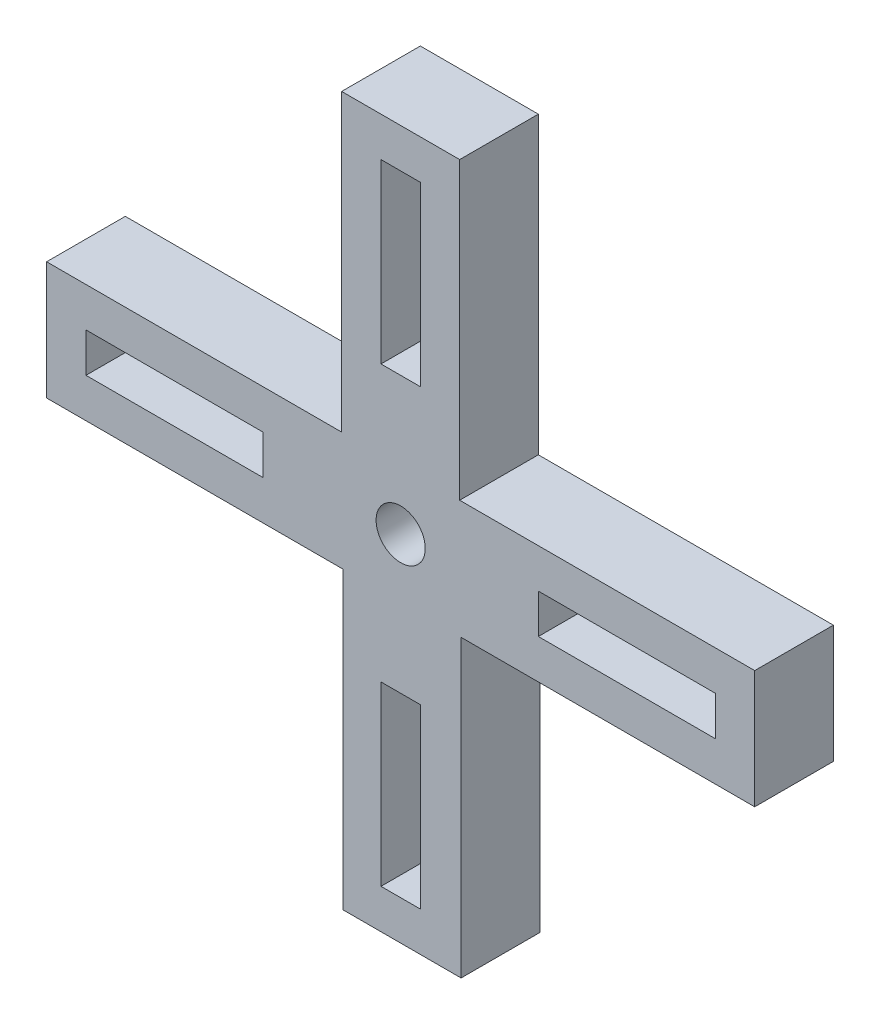
ISO-10303-21;
HEADER;
FILE_DESCRIPTION(('STEP AP214'),'2;1');
FILE_NAME('part.step','',(''),(''),'','','');
FILE_SCHEMA(('AUTOMOTIVE_DESIGN { 1 0 10303 214 1 1 1 1 }'));
ENDSEC;
DATA;
#1=APPLICATION_CONTEXT('core data for automotive mechanical design processes');
#2=APPLICATION_PROTOCOL_DEFINITION('international standard','automotive_design',2000,#1);
#3=PRODUCT_CONTEXT('',#1,'mechanical');
#4=PRODUCT('Part','Part','',(#3));
#5=PRODUCT_RELATED_PRODUCT_CATEGORY('part','',(#4));
#6=PRODUCT_DEFINITION_FORMATION('','',#4);
#7=PRODUCT_DEFINITION_CONTEXT('part definition',#1,'design');
#8=PRODUCT_DEFINITION('design','',#6,#7);
#9=PRODUCT_DEFINITION_SHAPE('','',#8);
#10=(LENGTH_UNIT() NAMED_UNIT(*) SI_UNIT(.MILLI.,.METRE.));
#11=(NAMED_UNIT(*) PLANE_ANGLE_UNIT() SI_UNIT($,.RADIAN.));
#12=(NAMED_UNIT(*) SI_UNIT($,.STERADIAN.) SOLID_ANGLE_UNIT());
#13=UNCERTAINTY_MEASURE_WITH_UNIT(LENGTH_MEASURE(1.E-05),#10,'distance_accuracy_value','');
#14=(GEOMETRIC_REPRESENTATION_CONTEXT(3) GLOBAL_UNCERTAINTY_ASSIGNED_CONTEXT((#13)) GLOBAL_UNIT_ASSIGNED_CONTEXT((#10,
#11,#12)) REPRESENTATION_CONTEXT('',''));
#15=CARTESIAN_POINT('',(0.,0.,0.));
#16=DIRECTION('',(0.,0.,1.));
#17=DIRECTION('',(1.,0.,0.));
#18=AXIS2_PLACEMENT_3D('',#15,#16,#17);
#19=CARTESIAN_POINT('',(0.,0.,4.));
#20=DIRECTION('',(0.,0.,-1.));
#21=DIRECTION('',(-1.,0.,0.));
#22=AXIS2_PLACEMENT_3D('',#19,#20,#21);
#23=PLANE('',#22);
#24=CARTESIAN_POINT('',(-3.,-18.,4.));
#25=DIRECTION('',(0.,0.,1.));
#26=DIRECTION('',(1.,0.,0.));
#27=AXIS2_PLACEMENT_3D('',#24,#25,#26);
#28=CIRCLE('',#27,1.25);
#29=CARTESIAN_POINT('',(-1.75,-18.,4.));
#30=VERTEX_POINT('',#29);
#31=EDGE_CURVE('E967',#30,#30,#28,.T.);
#32=ORIENTED_EDGE('',*,*,#31,.F.);
#33=EDGE_LOOP('',(#32));
#34=FACE_BOUND('',#33,.T.);
#35=DIRECTION('',(0.,-1.,0.));
#36=VECTOR('',#35,1.);
#37=CARTESIAN_POINT('',(4.,-17.,4.));
#38=LINE('',#37,#36);
#39=CARTESIAN_POINT('',(4.,-17.,4.));
#40=VERTEX_POINT('',#39);
#41=CARTESIAN_POINT('',(4.,-19.,4.));
#42=VERTEX_POINT('',#41);
#43=EDGE_CURVE('E448',#40,#42,#38,.T.);
#44=ORIENTED_EDGE('',*,*,#43,.F.);
#45=DIRECTION('',(1.,0.,0.));
#46=VECTOR('',#45,1.);
#47=CARTESIAN_POINT('',(4.,-17.,4.));
#48=LINE('',#47,#46);
#49=CARTESIAN_POINT('',(13.,-17.,4.));
#50=VERTEX_POINT('',#49);
#51=EDGE_CURVE('E456',#40,#50,#48,.T.);
#52=ORIENTED_EDGE('',*,*,#51,.T.);
#53=DIRECTION('',(0.,-1.,0.));
#54=VECTOR('',#53,1.);
#55=CARTESIAN_POINT('',(13.,-17.,4.));
#56=LINE('',#55,#54);
#57=CARTESIAN_POINT('',(13.,-19.,4.));
#58=VERTEX_POINT('',#57);
#59=EDGE_CURVE('E453',#50,#58,#56,.T.);
#60=ORIENTED_EDGE('',*,*,#59,.T.);
#61=DIRECTION('',(1.,0.,0.));
#62=VECTOR('',#61,1.);
#63=CARTESIAN_POINT('',(4.,-19.,4.));
#64=LINE('',#63,#62);
#65=EDGE_CURVE('E450',#42,#58,#64,.T.);
#66=ORIENTED_EDGE('',*,*,#65,.F.);
#67=EDGE_LOOP('',(#44,#52,#60,#66));
#68=FACE_BOUND('',#67,.T.);
#69=DIRECTION('',(-1.,0.,0.));
#70=VECTOR('',#69,1.);
#71=CARTESIAN_POINT('',(-2.,-2.,4.));
#72=LINE('',#71,#70);
#73=CARTESIAN_POINT('',(-2.,-2.,4.));
#74=VERTEX_POINT('',#73);
#75=CARTESIAN_POINT('',(-4.,-2.,4.));
#76=VERTEX_POINT('',#75);
#77=EDGE_CURVE('E512',#74,#76,#72,.T.);
#78=ORIENTED_EDGE('',*,*,#77,.F.);
#79=DIRECTION('',(0.,1.,0.));
#80=VECTOR('',#79,1.);
#81=CARTESIAN_POINT('',(-2.,-11.,4.));
#82=LINE('',#81,#80);
#83=CARTESIAN_POINT('',(-2.,-11.,4.));
#84=VERTEX_POINT('',#83);
#85=EDGE_CURVE('E520',#84,#74,#82,.T.);
#86=ORIENTED_EDGE('',*,*,#85,.F.);
#87=DIRECTION('',(1.,0.,0.));
#88=VECTOR('',#87,1.);
#89=CARTESIAN_POINT('',(-4.,-11.,4.));
#90=LINE('',#89,#88);
#91=CARTESIAN_POINT('',(-4.,-11.,4.));
#92=VERTEX_POINT('',#91);
#93=EDGE_CURVE('E517',#92,#84,#90,.T.);
#94=ORIENTED_EDGE('',*,*,#93,.F.);
#95=DIRECTION('',(0.,-1.,0.));
#96=VECTOR('',#95,1.);
#97=CARTESIAN_POINT('',(-4.,-2.,4.));
#98=LINE('',#97,#96);
#99=EDGE_CURVE('E514',#76,#92,#98,.T.);
#100=ORIENTED_EDGE('',*,*,#99,.F.);
#101=EDGE_LOOP('',(#78,#86,#94,#100));
#102=FACE_BOUND('',#101,.T.);
#103=DIRECTION('',(-1.,0.,0.));
#104=VECTOR('',#103,1.);
#105=CARTESIAN_POINT('',(15.,-15.,4.));
#106=LINE('',#105,#104);
#107=CARTESIAN_POINT('',(15.,-15.,4.));
#108=VERTEX_POINT('',#107);
#109=CARTESIAN_POINT('',(0.,-15.,4.));
#110=VERTEX_POINT('',#109);
#111=EDGE_CURVE('E543',#108,#110,#106,.T.);
#112=ORIENTED_EDGE('',*,*,#111,.T.);
#113=DIRECTION('',(0.,1.,0.));
#114=VECTOR('',#113,1.);
#115=CARTESIAN_POINT('',(0.,-15.,4.));
#116=LINE('',#115,#114);
#117=CARTESIAN_POINT('',(0.,0.,4.));
#118=VERTEX_POINT('',#117);
#119=EDGE_CURVE('E546',#110,#118,#116,.T.);
#120=ORIENTED_EDGE('',*,*,#119,.T.);
#121=DIRECTION('',(-1.,0.,0.));
#122=VECTOR('',#121,1.);
#123=CARTESIAN_POINT('',(0.,0.,4.));
#124=LINE('',#123,#122);
#125=CARTESIAN_POINT('',(-6.,0.,4.));
#126=VERTEX_POINT('',#125);
#127=EDGE_CURVE('E549',#118,#126,#124,.T.);
#128=ORIENTED_EDGE('',*,*,#127,.T.);
#129=DIRECTION('',(0.,-1.,0.));
#130=VECTOR('',#129,1.);
#131=CARTESIAN_POINT('',(-6.,0.,4.));
#132=LINE('',#131,#130);
#133=CARTESIAN_POINT('',(-6.,-15.,4.));
#134=VERTEX_POINT('',#133);
#135=EDGE_CURVE('E551',#126,#134,#132,.T.);
#136=ORIENTED_EDGE('',*,*,#135,.T.);
#137=DIRECTION('',(-1.,0.,0.));
#138=VECTOR('',#137,1.);
#139=CARTESIAN_POINT('',(-6.,-15.,4.));
#140=LINE('',#139,#138);
#141=CARTESIAN_POINT('',(-21.,-15.,4.));
#142=VERTEX_POINT('',#141);
#143=EDGE_CURVE('E553',#134,#142,#140,.T.);
#144=ORIENTED_EDGE('',*,*,#143,.T.);
#145=DIRECTION('',(0.,-1.,0.));
#146=VECTOR('',#145,1.);
#147=CARTESIAN_POINT('',(-21.,-15.,4.));
#148=LINE('',#147,#146);
#149=CARTESIAN_POINT('',(-21.,-21.,4.));
#150=VERTEX_POINT('',#149);
#151=EDGE_CURVE('E555',#142,#150,#148,.T.);
#152=ORIENTED_EDGE('',*,*,#151,.T.);
#153=DIRECTION('',(1.,0.,0.));
#154=VECTOR('',#153,1.);
#155=CARTESIAN_POINT('',(-21.,-21.,4.));
#156=LINE('',#155,#154);
#157=CARTESIAN_POINT('',(-5.92785465377647,-21.,4.));
#158=VERTEX_POINT('',#157);
#159=EDGE_CURVE('E557',#150,#158,#156,.T.);
#160=ORIENTED_EDGE('',*,*,#159,.T.);
#161=DIRECTION('',(0.,-1.,0.));
#162=VECTOR('',#161,1.);
#163=CARTESIAN_POINT('',(-5.92785465377647,-21.,4.));
#164=LINE('',#163,#162);
#165=CARTESIAN_POINT('',(-5.92785465377647,-36.,4.));
#166=VERTEX_POINT('',#165);
#167=EDGE_CURVE('E559',#158,#166,#164,.T.);
#168=ORIENTED_EDGE('',*,*,#167,.T.);
#169=DIRECTION('',(1.,0.,0.));
#170=VECTOR('',#169,1.);
#171=CARTESIAN_POINT('',(-5.92785465377647,-36.,4.));
#172=LINE('',#171,#170);
#173=CARTESIAN_POINT('',(0.0721453462235299,-36.,4.));
#174=VERTEX_POINT('',#173);
#175=EDGE_CURVE('E561',#166,#174,#172,.T.);
#176=ORIENTED_EDGE('',*,*,#175,.T.);
#177=DIRECTION('',(0.,1.,0.));
#178=VECTOR('',#177,1.);
#179=CARTESIAN_POINT('',(0.0721453462235299,-36.,4.));
#180=LINE('',#179,#178);
#181=CARTESIAN_POINT('',(0.0721453462235299,-21.,4.));
#182=VERTEX_POINT('',#181);
#183=EDGE_CURVE('E563',#174,#182,#180,.T.);
#184=ORIENTED_EDGE('',*,*,#183,.T.);
#185=DIRECTION('',(1.,0.,0.));
#186=VECTOR('',#185,1.);
#187=CARTESIAN_POINT('',(0.0721453462235299,-21.,4.));
#188=LINE('',#187,#186);
#189=CARTESIAN_POINT('',(15.,-21.,4.));
#190=VERTEX_POINT('',#189);
#191=EDGE_CURVE('E565',#182,#190,#188,.T.);
#192=ORIENTED_EDGE('',*,*,#191,.T.);
#193=DIRECTION('',(0.,1.,0.));
#194=VECTOR('',#193,1.);
#195=CARTESIAN_POINT('',(15.,-21.,4.));
#196=LINE('',#195,#194);
#197=EDGE_CURVE('E567',#190,#108,#196,.T.);
#198=ORIENTED_EDGE('',*,*,#197,.T.);
#199=EDGE_LOOP('',(#112,#120,#128,#136,#144,#152,#160,#168,#176,#184,#192,#198));
#200=FACE_BOUND('',#199,.T.);
#201=DIRECTION('',(0.,-1.,0.));
#202=VECTOR('',#201,1.);
#203=CARTESIAN_POINT('',(-4.,-25.,4.));
#204=LINE('',#203,#202);
#205=CARTESIAN_POINT('',(-4.,-25.,4.));
#206=VERTEX_POINT('',#205);
#207=CARTESIAN_POINT('',(-4.,-34.,4.));
#208=VERTEX_POINT('',#207);
#209=EDGE_CURVE('E480',#206,#208,#204,.T.);
#210=ORIENTED_EDGE('',*,*,#209,.F.);
#211=DIRECTION('',(1.,0.,0.));
#212=VECTOR('',#211,1.);
#213=CARTESIAN_POINT('',(-4.,-25.,4.));
#214=LINE('',#213,#212);
#215=CARTESIAN_POINT('',(-2.,-25.,4.));
#216=VERTEX_POINT('',#215);
#217=EDGE_CURVE('E488',#206,#216,#214,.T.);
#218=ORIENTED_EDGE('',*,*,#217,.T.);
#219=DIRECTION('',(0.,-1.,0.));
#220=VECTOR('',#219,1.);
#221=CARTESIAN_POINT('',(-2.,-25.,4.));
#222=LINE('',#221,#220);
#223=CARTESIAN_POINT('',(-2.,-34.,4.));
#224=VERTEX_POINT('',#223);
#225=EDGE_CURVE('E485',#216,#224,#222,.T.);
#226=ORIENTED_EDGE('',*,*,#225,.T.);
#227=DIRECTION('',(1.,0.,0.));
#228=VECTOR('',#227,1.);
#229=CARTESIAN_POINT('',(-4.,-34.,4.));
#230=LINE('',#229,#228);
#231=EDGE_CURVE('E482',#208,#224,#230,.T.);
#232=ORIENTED_EDGE('',*,*,#231,.F.);
#233=EDGE_LOOP('',(#210,#218,#226,#232));
#234=FACE_BOUND('',#233,.T.);
#235=DIRECTION('',(0.,-1.,0.));
#236=VECTOR('',#235,1.);
#237=CARTESIAN_POINT('',(-19.,-17.,4.));
#238=LINE('',#237,#236);
#239=CARTESIAN_POINT('',(-19.,-17.,4.));
#240=VERTEX_POINT('',#239);
#241=CARTESIAN_POINT('',(-19.,-19.,4.));
#242=VERTEX_POINT('',#241);
#243=EDGE_CURVE('E410',#240,#242,#238,.T.);
#244=ORIENTED_EDGE('',*,*,#243,.F.);
#245=DIRECTION('',(-1.,0.,0.));
#246=VECTOR('',#245,1.);
#247=CARTESIAN_POINT('',(-10.,-17.,4.));
#248=LINE('',#247,#246);
#249=CARTESIAN_POINT('',(-10.,-17.,4.));
#250=VERTEX_POINT('',#249);
#251=EDGE_CURVE('E432',#250,#240,#248,.T.);
#252=ORIENTED_EDGE('',*,*,#251,.F.);
#253=DIRECTION('',(0.,1.,0.));
#254=VECTOR('',#253,1.);
#255=CARTESIAN_POINT('',(-10.,-19.,4.));
#256=LINE('',#255,#254);
#257=CARTESIAN_POINT('',(-10.,-19.,4.));
#258=VERTEX_POINT('',#257);
#259=EDGE_CURVE('E430',#258,#250,#256,.T.);
#260=ORIENTED_EDGE('',*,*,#259,.F.);
#261=DIRECTION('',(1.,0.,0.));
#262=VECTOR('',#261,1.);
#263=CARTESIAN_POINT('',(-19.,-19.,4.));
#264=LINE('',#263,#262);
#265=EDGE_CURVE('E418',#242,#258,#264,.T.);
#266=ORIENTED_EDGE('',*,*,#265,.F.);
#267=EDGE_LOOP('',(#244,#252,#260,#266));
#268=FACE_BOUND('',#267,.T.);
#269=ADVANCED_FACE('F225',(#34,#68,#102,#200,#234,#268),#23,.F.);
#270=CARTESIAN_POINT('',(0.,0.,0.));
#271=DIRECTION('',(0.,0.,-1.));
#272=DIRECTION('',(-1.,0.,0.));
#273=AXIS2_PLACEMENT_3D('',#270,#271,#272);
#274=PLANE('',#273);
#275=CARTESIAN_POINT('',(-3.,-18.,0.));
#276=DIRECTION('',(0.,0.,1.));
#277=DIRECTION('',(1.,0.,0.));
#278=AXIS2_PLACEMENT_3D('',#275,#276,#277);
#279=CIRCLE('',#278,1.25);
#280=CARTESIAN_POINT('',(-1.75,-18.,0.));
#281=VERTEX_POINT('',#280);
#282=EDGE_CURVE('E438',#281,#281,#279,.T.);
#283=ORIENTED_EDGE('',*,*,#282,.T.);
#284=EDGE_LOOP('',(#283));
#285=FACE_BOUND('',#284,.T.);
#286=DIRECTION('',(1.,0.,0.));
#287=VECTOR('',#286,1.);
#288=CARTESIAN_POINT('',(4.,-17.,0.));
#289=LINE('',#288,#287);
#290=CARTESIAN_POINT('',(4.,-17.,0.));
#291=VERTEX_POINT('',#290);
#292=CARTESIAN_POINT('',(13.,-17.,0.));
#293=VERTEX_POINT('',#292);
#294=EDGE_CURVE('E451',#291,#293,#289,.T.);
#295=ORIENTED_EDGE('',*,*,#294,.F.);
#296=DIRECTION('',(0.,-1.,0.));
#297=VECTOR('',#296,1.);
#298=CARTESIAN_POINT('',(4.,-17.,0.));
#299=LINE('',#298,#297);
#300=CARTESIAN_POINT('',(4.,-19.,0.));
#301=VERTEX_POINT('',#300);
#302=EDGE_CURVE('E426',#291,#301,#299,.T.);
#303=ORIENTED_EDGE('',*,*,#302,.T.);
#304=DIRECTION('',(1.,0.,0.));
#305=VECTOR('',#304,1.);
#306=CARTESIAN_POINT('',(4.,-19.,0.));
#307=LINE('',#306,#305);
#308=CARTESIAN_POINT('',(13.,-19.,0.));
#309=VERTEX_POINT('',#308);
#310=EDGE_CURVE('E462',#301,#309,#307,.T.);
#311=ORIENTED_EDGE('',*,*,#310,.T.);
#312=DIRECTION('',(0.,-1.,0.));
#313=VECTOR('',#312,1.);
#314=CARTESIAN_POINT('',(13.,-17.,0.));
#315=LINE('',#314,#313);
#316=EDGE_CURVE('E465',#293,#309,#315,.T.);
#317=ORIENTED_EDGE('',*,*,#316,.F.);
#318=EDGE_LOOP('',(#295,#303,#311,#317));
#319=FACE_BOUND('',#318,.T.);
#320=DIRECTION('',(0.,1.,0.));
#321=VECTOR('',#320,1.);
#322=CARTESIAN_POINT('',(-2.,-11.,0.));
#323=LINE('',#322,#321);
#324=CARTESIAN_POINT('',(-2.,-11.,0.));
#325=VERTEX_POINT('',#324);
#326=CARTESIAN_POINT('',(-2.,-2.,0.));
#327=VERTEX_POINT('',#326);
#328=EDGE_CURVE('E515',#325,#327,#323,.T.);
#329=ORIENTED_EDGE('',*,*,#328,.T.);
#330=DIRECTION('',(-1.,0.,0.));
#331=VECTOR('',#330,1.);
#332=CARTESIAN_POINT('',(-2.,-2.,0.));
#333=LINE('',#332,#331);
#334=CARTESIAN_POINT('',(-4.,-2.,0.));
#335=VERTEX_POINT('',#334);
#336=EDGE_CURVE('E511',#327,#335,#333,.T.);
#337=ORIENTED_EDGE('',*,*,#336,.T.);
#338=DIRECTION('',(0.,-1.,0.));
#339=VECTOR('',#338,1.);
#340=CARTESIAN_POINT('',(-4.,-2.,0.));
#341=LINE('',#340,#339);
#342=CARTESIAN_POINT('',(-4.,-11.,0.));
#343=VERTEX_POINT('',#342);
#344=EDGE_CURVE('E525',#335,#343,#341,.T.);
#345=ORIENTED_EDGE('',*,*,#344,.T.);
#346=DIRECTION('',(1.,0.,0.));
#347=VECTOR('',#346,1.);
#348=CARTESIAN_POINT('',(-4.,-11.,0.));
#349=LINE('',#348,#347);
#350=EDGE_CURVE('E528',#343,#325,#349,.T.);
#351=ORIENTED_EDGE('',*,*,#350,.T.);
#352=EDGE_LOOP('',(#329,#337,#345,#351));
#353=FACE_BOUND('',#352,.T.);
#354=DIRECTION('',(-1.,0.,0.));
#355=VECTOR('',#354,1.);
#356=CARTESIAN_POINT('',(15.,-15.,0.));
#357=LINE('',#356,#355);
#358=CARTESIAN_POINT('',(15.,-15.,0.));
#359=VERTEX_POINT('',#358);
#360=CARTESIAN_POINT('',(0.,-15.,0.));
#361=VERTEX_POINT('',#360);
#362=EDGE_CURVE('E542',#359,#361,#357,.T.);
#363=ORIENTED_EDGE('',*,*,#362,.F.);
#364=DIRECTION('',(0.,1.,0.));
#365=VECTOR('',#364,1.);
#366=CARTESIAN_POINT('',(15.,-21.,0.));
#367=LINE('',#366,#365);
#368=CARTESIAN_POINT('',(15.,-21.,0.));
#369=VERTEX_POINT('',#368);
#370=EDGE_CURVE('E547',#369,#359,#367,.T.);
#371=ORIENTED_EDGE('',*,*,#370,.F.);
#372=DIRECTION('',(1.,0.,0.));
#373=VECTOR('',#372,1.);
#374=CARTESIAN_POINT('',(0.0721453462235299,-21.,0.));
#375=LINE('',#374,#373);
#376=CARTESIAN_POINT('',(0.0721453462235299,-21.,0.));
#377=VERTEX_POINT('',#376);
#378=EDGE_CURVE('E590',#377,#369,#375,.T.);
#379=ORIENTED_EDGE('',*,*,#378,.F.);
#380=DIRECTION('',(0.,1.,0.));
#381=VECTOR('',#380,1.);
#382=CARTESIAN_POINT('',(0.0721453462235299,-36.,0.));
#383=LINE('',#382,#381);
#384=CARTESIAN_POINT('',(0.0721453462235299,-36.,0.));
#385=VERTEX_POINT('',#384);
#386=EDGE_CURVE('E588',#385,#377,#383,.T.);
#387=ORIENTED_EDGE('',*,*,#386,.F.);
#388=DIRECTION('',(1.,0.,0.));
#389=VECTOR('',#388,1.);
#390=CARTESIAN_POINT('',(-5.92785465377647,-36.,0.));
#391=LINE('',#390,#389);
#392=CARTESIAN_POINT('',(-5.92785465377647,-36.,0.));
#393=VERTEX_POINT('',#392);
#394=EDGE_CURVE('E586',#393,#385,#391,.T.);
#395=ORIENTED_EDGE('',*,*,#394,.F.);
#396=DIRECTION('',(0.,-1.,0.));
#397=VECTOR('',#396,1.);
#398=CARTESIAN_POINT('',(-5.92785465377647,-21.,0.));
#399=LINE('',#398,#397);
#400=CARTESIAN_POINT('',(-5.92785465377647,-21.,0.));
#401=VERTEX_POINT('',#400);
#402=EDGE_CURVE('E584',#401,#393,#399,.T.);
#403=ORIENTED_EDGE('',*,*,#402,.F.);
#404=DIRECTION('',(1.,0.,0.));
#405=VECTOR('',#404,1.);
#406=CARTESIAN_POINT('',(-21.,-21.,0.));
#407=LINE('',#406,#405);
#408=CARTESIAN_POINT('',(-21.,-21.,0.));
#409=VERTEX_POINT('',#408);
#410=EDGE_CURVE('E582',#409,#401,#407,.T.);
#411=ORIENTED_EDGE('',*,*,#410,.F.);
#412=DIRECTION('',(0.,-1.,0.));
#413=VECTOR('',#412,1.);
#414=CARTESIAN_POINT('',(-21.,-15.,0.));
#415=LINE('',#414,#413);
#416=CARTESIAN_POINT('',(-21.,-15.,0.));
#417=VERTEX_POINT('',#416);
#418=EDGE_CURVE('E580',#417,#409,#415,.T.);
#419=ORIENTED_EDGE('',*,*,#418,.F.);
#420=DIRECTION('',(-1.,0.,0.));
#421=VECTOR('',#420,1.);
#422=CARTESIAN_POINT('',(-6.,-15.,0.));
#423=LINE('',#422,#421);
#424=CARTESIAN_POINT('',(-6.,-15.,0.));
#425=VERTEX_POINT('',#424);
#426=EDGE_CURVE('E578',#425,#417,#423,.T.);
#427=ORIENTED_EDGE('',*,*,#426,.F.);
#428=DIRECTION('',(0.,-1.,0.));
#429=VECTOR('',#428,1.);
#430=CARTESIAN_POINT('',(-6.,0.,0.));
#431=LINE('',#430,#429);
#432=CARTESIAN_POINT('',(-6.,0.,0.));
#433=VERTEX_POINT('',#432);
#434=EDGE_CURVE('E576',#433,#425,#431,.T.);
#435=ORIENTED_EDGE('',*,*,#434,.F.);
#436=DIRECTION('',(-1.,0.,0.));
#437=VECTOR('',#436,1.);
#438=CARTESIAN_POINT('',(0.,0.,0.));
#439=LINE('',#438,#437);
#440=CARTESIAN_POINT('',(0.,0.,0.));
#441=VERTEX_POINT('',#440);
#442=EDGE_CURVE('E574',#441,#433,#439,.T.);
#443=ORIENTED_EDGE('',*,*,#442,.F.);
#444=DIRECTION('',(0.,1.,0.));
#445=VECTOR('',#444,1.);
#446=CARTESIAN_POINT('',(0.,-15.,0.));
#447=LINE('',#446,#445);
#448=EDGE_CURVE('E572',#361,#441,#447,.T.);
#449=ORIENTED_EDGE('',*,*,#448,.F.);
#450=EDGE_LOOP('',(#363,#371,#379,#387,#395,#403,#411,#419,#427,#435,#443,#449));
#451=FACE_BOUND('',#450,.T.);
#452=DIRECTION('',(1.,0.,0.));
#453=VECTOR('',#452,1.);
#454=CARTESIAN_POINT('',(-4.,-25.,0.));
#455=LINE('',#454,#453);
#456=CARTESIAN_POINT('',(-4.,-25.,0.));
#457=VERTEX_POINT('',#456);
#458=CARTESIAN_POINT('',(-2.,-25.,0.));
#459=VERTEX_POINT('',#458);
#460=EDGE_CURVE('E483',#457,#459,#455,.T.);
#461=ORIENTED_EDGE('',*,*,#460,.F.);
#462=DIRECTION('',(0.,-1.,0.));
#463=VECTOR('',#462,1.);
#464=CARTESIAN_POINT('',(-4.,-25.,0.));
#465=LINE('',#464,#463);
#466=CARTESIAN_POINT('',(-4.,-34.,0.));
#467=VERTEX_POINT('',#466);
#468=EDGE_CURVE('E479',#457,#467,#465,.T.);
#469=ORIENTED_EDGE('',*,*,#468,.T.);
#470=DIRECTION('',(1.,0.,0.));
#471=VECTOR('',#470,1.);
#472=CARTESIAN_POINT('',(-4.,-34.,0.));
#473=LINE('',#472,#471);
#474=CARTESIAN_POINT('',(-2.,-34.,0.));
#475=VERTEX_POINT('',#474);
#476=EDGE_CURVE('E494',#467,#475,#473,.T.);
#477=ORIENTED_EDGE('',*,*,#476,.T.);
#478=DIRECTION('',(0.,-1.,0.));
#479=VECTOR('',#478,1.);
#480=CARTESIAN_POINT('',(-2.,-25.,0.));
#481=LINE('',#480,#479);
#482=EDGE_CURVE('E497',#459,#475,#481,.T.);
#483=ORIENTED_EDGE('',*,*,#482,.F.);
#484=EDGE_LOOP('',(#461,#469,#477,#483));
#485=FACE_BOUND('',#484,.T.);
#486=DIRECTION('',(-1.,0.,0.));
#487=VECTOR('',#486,1.);
#488=CARTESIAN_POINT('',(-10.,-17.,0.));
#489=LINE('',#488,#487);
#490=CARTESIAN_POINT('',(-10.,-17.,0.));
#491=VERTEX_POINT('',#490);
#492=CARTESIAN_POINT('',(-19.,-17.,0.));
#493=VERTEX_POINT('',#492);
#494=EDGE_CURVE('E419',#491,#493,#489,.T.);
#495=ORIENTED_EDGE('',*,*,#494,.T.);
#496=DIRECTION('',(0.,-1.,0.));
#497=VECTOR('',#496,1.);
#498=CARTESIAN_POINT('',(-19.,-17.,0.));
#499=LINE('',#498,#497);
#500=CARTESIAN_POINT('',(-19.,-19.,0.));
#501=VERTEX_POINT('',#500);
#502=EDGE_CURVE('E248',#493,#501,#499,.T.);
#503=ORIENTED_EDGE('',*,*,#502,.T.);
#504=DIRECTION('',(1.,0.,0.));
#505=VECTOR('',#504,1.);
#506=CARTESIAN_POINT('',(-19.,-19.,0.));
#507=LINE('',#506,#505);
#508=CARTESIAN_POINT('',(-10.,-19.,0.));
#509=VERTEX_POINT('',#508);
#510=EDGE_CURVE('E425',#501,#509,#507,.T.);
#511=ORIENTED_EDGE('',*,*,#510,.T.);
#512=DIRECTION('',(0.,1.,0.));
#513=VECTOR('',#512,1.);
#514=CARTESIAN_POINT('',(-10.,-19.,0.));
#515=LINE('',#514,#513);
#516=EDGE_CURVE('E440',#509,#491,#515,.T.);
#517=ORIENTED_EDGE('',*,*,#516,.T.);
#518=EDGE_LOOP('',(#495,#503,#511,#517));
#519=FACE_BOUND('',#518,.T.);
#520=ADVANCED_FACE('F632',(#285,#319,#353,#451,#485,#519),#274,.T.);
#521=CARTESIAN_POINT('',(15.,-15.,4.));
#522=DIRECTION('',(0.,-1.,0.));
#523=DIRECTION('',(1.,0.,0.));
#524=AXIS2_PLACEMENT_3D('',#521,#522,#523);
#525=PLANE('',#524);
#526=ORIENTED_EDGE('',*,*,#362,.T.);
#527=DIRECTION('',(0.,0.,-1.));
#528=VECTOR('',#527,1.);
#529=CARTESIAN_POINT('',(0.,-15.,4.));
#530=LINE('',#529,#528);
#531=EDGE_CURVE('E12',#110,#361,#530,.T.);
#532=ORIENTED_EDGE('',*,*,#531,.F.);
#533=ORIENTED_EDGE('',*,*,#111,.F.);
#534=DIRECTION('',(0.,0.,-1.));
#535=VECTOR('',#534,1.);
#536=CARTESIAN_POINT('',(15.,-15.,4.));
#537=LINE('',#536,#535);
#538=EDGE_CURVE('E569',#108,#359,#537,.T.);
#539=ORIENTED_EDGE('',*,*,#538,.T.);
#540=EDGE_LOOP('',(#526,#532,#533,#539));
#541=FACE_BOUND('',#540,.T.);
#542=ADVANCED_FACE('F227',(#541),#525,.F.);
#543=CARTESIAN_POINT('',(0.,-15.,4.));
#544=DIRECTION('',(-1.,0.,0.));
#545=DIRECTION('',(0.,0.,1.));
#546=AXIS2_PLACEMENT_3D('',#543,#544,#545);
#547=PLANE('',#546);
#548=ORIENTED_EDGE('',*,*,#448,.T.);
#549=DIRECTION('',(0.,0.,-1.));
#550=VECTOR('',#549,1.);
#551=CARTESIAN_POINT('',(0.,0.,4.));
#552=LINE('',#551,#550);
#553=EDGE_CURVE('E233',#118,#441,#552,.T.);
#554=ORIENTED_EDGE('',*,*,#553,.F.);
#555=ORIENTED_EDGE('',*,*,#119,.F.);
#556=ORIENTED_EDGE('',*,*,#531,.T.);
#557=EDGE_LOOP('',(#548,#554,#555,#556));
#558=FACE_BOUND('',#557,.T.);
#559=ADVANCED_FACE('F650',(#558),#547,.F.);
#560=CARTESIAN_POINT('',(0.,0.,4.));
#561=DIRECTION('',(0.,-1.,0.));
#562=DIRECTION('',(1.,0.,0.));
#563=AXIS2_PLACEMENT_3D('',#560,#561,#562);
#564=PLANE('',#563);
#565=ORIENTED_EDGE('',*,*,#442,.T.);
#566=DIRECTION('',(0.,0.,-1.));
#567=VECTOR('',#566,1.);
#568=CARTESIAN_POINT('',(-6.,0.,4.));
#569=LINE('',#568,#567);
#570=EDGE_CURVE('E619',#126,#433,#569,.T.);
#571=ORIENTED_EDGE('',*,*,#570,.F.);
#572=ORIENTED_EDGE('',*,*,#127,.F.);
#573=ORIENTED_EDGE('',*,*,#553,.T.);
#574=EDGE_LOOP('',(#565,#571,#572,#573));
#575=FACE_BOUND('',#574,.T.);
#576=ADVANCED_FACE('F626',(#575),#564,.F.);
#577=CARTESIAN_POINT('',(-6.,0.,4.));
#578=DIRECTION('',(1.,0.,0.));
#579=DIRECTION('',(0.,1.,0.));
#580=AXIS2_PLACEMENT_3D('',#577,#578,#579);
#581=PLANE('',#580);
#582=ORIENTED_EDGE('',*,*,#434,.T.);
#583=DIRECTION('',(0.,0.,-1.));
#584=VECTOR('',#583,1.);
#585=CARTESIAN_POINT('',(-6.,-15.,4.));
#586=LINE('',#585,#584);
#587=EDGE_CURVE('E616',#134,#425,#586,.T.);
#588=ORIENTED_EDGE('',*,*,#587,.F.);
#589=ORIENTED_EDGE('',*,*,#135,.F.);
#590=ORIENTED_EDGE('',*,*,#570,.T.);
#591=EDGE_LOOP('',(#582,#588,#589,#590));
#592=FACE_BOUND('',#591,.T.);
#593=ADVANCED_FACE('F638',(#592),#581,.F.);
#594=CARTESIAN_POINT('',(-6.,-15.,4.));
#595=DIRECTION('',(0.,-1.,0.));
#596=DIRECTION('',(1.,0.,0.));
#597=AXIS2_PLACEMENT_3D('',#594,#595,#596);
#598=PLANE('',#597);
#599=ORIENTED_EDGE('',*,*,#426,.T.);
#600=DIRECTION('',(0.,0.,-1.));
#601=VECTOR('',#600,1.);
#602=CARTESIAN_POINT('',(-21.,-15.,4.));
#603=LINE('',#602,#601);
#604=EDGE_CURVE('E613',#142,#417,#603,.T.);
#605=ORIENTED_EDGE('',*,*,#604,.F.);
#606=ORIENTED_EDGE('',*,*,#143,.F.);
#607=ORIENTED_EDGE('',*,*,#587,.T.);
#608=EDGE_LOOP('',(#599,#605,#606,#607));
#609=FACE_BOUND('',#608,.T.);
#610=ADVANCED_FACE('F642',(#609),#598,.F.);
#611=CARTESIAN_POINT('',(-21.,-15.,4.));
#612=DIRECTION('',(1.,0.,0.));
#613=DIRECTION('',(0.,0.,-1.));
#614=AXIS2_PLACEMENT_3D('',#611,#612,#613);
#615=PLANE('',#614);
#616=ORIENTED_EDGE('',*,*,#418,.T.);
#617=DIRECTION('',(0.,0.,-1.));
#618=VECTOR('',#617,1.);
#619=CARTESIAN_POINT('',(-21.,-21.,4.));
#620=LINE('',#619,#618);
#621=EDGE_CURVE('E610',#150,#409,#620,.T.);
#622=ORIENTED_EDGE('',*,*,#621,.F.);
#623=ORIENTED_EDGE('',*,*,#151,.F.);
#624=ORIENTED_EDGE('',*,*,#604,.T.);
#625=EDGE_LOOP('',(#616,#622,#623,#624));
#626=FACE_BOUND('',#625,.T.);
#627=ADVANCED_FACE('F683',(#626),#615,.F.);
#628=CARTESIAN_POINT('',(-21.,-21.,4.));
#629=DIRECTION('',(0.,1.,0.));
#630=DIRECTION('',(0.,0.,1.));
#631=AXIS2_PLACEMENT_3D('',#628,#629,#630);
#632=PLANE('',#631);
#633=ORIENTED_EDGE('',*,*,#410,.T.);
#634=DIRECTION('',(0.,0.,-1.));
#635=VECTOR('',#634,1.);
#636=CARTESIAN_POINT('',(-5.92785465377647,-21.,4.));
#637=LINE('',#636,#635);
#638=EDGE_CURVE('E607',#158,#401,#637,.T.);
#639=ORIENTED_EDGE('',*,*,#638,.F.);
#640=ORIENTED_EDGE('',*,*,#159,.F.);
#641=ORIENTED_EDGE('',*,*,#621,.T.);
#642=EDGE_LOOP('',(#633,#639,#640,#641));
#643=FACE_BOUND('',#642,.T.);
#644=ADVANCED_FACE('F681',(#643),#632,.F.);
#645=CARTESIAN_POINT('',(-5.92785465377647,-21.,4.));
#646=DIRECTION('',(1.,0.,0.));
#647=DIRECTION('',(0.,1.,0.));
#648=AXIS2_PLACEMENT_3D('',#645,#646,#647);
#649=PLANE('',#648);
#650=ORIENTED_EDGE('',*,*,#402,.T.);
#651=DIRECTION('',(0.,0.,-1.));
#652=VECTOR('',#651,1.);
#653=CARTESIAN_POINT('',(-5.92785465377647,-36.,4.));
#654=LINE('',#653,#652);
#655=EDGE_CURVE('E604',#166,#393,#654,.T.);
#656=ORIENTED_EDGE('',*,*,#655,.F.);
#657=ORIENTED_EDGE('',*,*,#167,.F.);
#658=ORIENTED_EDGE('',*,*,#638,.T.);
#659=EDGE_LOOP('',(#650,#656,#657,#658));
#660=FACE_BOUND('',#659,.T.);
#661=ADVANCED_FACE('F677',(#660),#649,.F.);
#662=CARTESIAN_POINT('',(-5.92785465377647,-36.,4.));
#663=DIRECTION('',(0.,1.,0.));
#664=DIRECTION('',(0.,0.,1.));
#665=AXIS2_PLACEMENT_3D('',#662,#663,#664);
#666=PLANE('',#665);
#667=ORIENTED_EDGE('',*,*,#394,.T.);
#668=DIRECTION('',(0.,0.,-1.));
#669=VECTOR('',#668,1.);
#670=CARTESIAN_POINT('',(0.0721453462235299,-36.,4.));
#671=LINE('',#670,#669);
#672=EDGE_CURVE('E601',#174,#385,#671,.T.);
#673=ORIENTED_EDGE('',*,*,#672,.F.);
#674=ORIENTED_EDGE('',*,*,#175,.F.);
#675=ORIENTED_EDGE('',*,*,#655,.T.);
#676=EDGE_LOOP('',(#667,#673,#674,#675));
#677=FACE_BOUND('',#676,.T.);
#678=ADVANCED_FACE('F672',(#677),#666,.F.);
#679=CARTESIAN_POINT('',(0.0721453462235299,-36.,4.));
#680=DIRECTION('',(-1.,0.,0.));
#681=DIRECTION('',(0.,0.,1.));
#682=AXIS2_PLACEMENT_3D('',#679,#680,#681);
#683=PLANE('',#682);
#684=ORIENTED_EDGE('',*,*,#386,.T.);
#685=DIRECTION('',(0.,0.,-1.));
#686=VECTOR('',#685,1.);
#687=CARTESIAN_POINT('',(0.0721453462235299,-21.,4.));
#688=LINE('',#687,#686);
#689=EDGE_CURVE('E598',#182,#377,#688,.T.);
#690=ORIENTED_EDGE('',*,*,#689,.F.);
#691=ORIENTED_EDGE('',*,*,#183,.F.);
#692=ORIENTED_EDGE('',*,*,#672,.T.);
#693=EDGE_LOOP('',(#684,#690,#691,#692));
#694=FACE_BOUND('',#693,.T.);
#695=ADVANCED_FACE('F666',(#694),#683,.F.);
#696=CARTESIAN_POINT('',(0.0721453462235299,-21.,4.));
#697=DIRECTION('',(0.,1.,0.));
#698=DIRECTION('',(0.,0.,1.));
#699=AXIS2_PLACEMENT_3D('',#696,#697,#698);
#700=PLANE('',#699);
#701=ORIENTED_EDGE('',*,*,#378,.T.);
#702=DIRECTION('',(0.,0.,-1.));
#703=VECTOR('',#702,1.);
#704=CARTESIAN_POINT('',(15.,-21.,4.));
#705=LINE('',#704,#703);
#706=EDGE_CURVE('E595',#190,#369,#705,.T.);
#707=ORIENTED_EDGE('',*,*,#706,.F.);
#708=ORIENTED_EDGE('',*,*,#191,.F.);
#709=ORIENTED_EDGE('',*,*,#689,.T.);
#710=EDGE_LOOP('',(#701,#707,#708,#709));
#711=FACE_BOUND('',#710,.T.);
#712=ADVANCED_FACE('F662',(#711),#700,.F.);
#713=CARTESIAN_POINT('',(15.,-21.,4.));
#714=DIRECTION('',(-1.,0.,0.));
#715=DIRECTION('',(0.,0.,1.));
#716=AXIS2_PLACEMENT_3D('',#713,#714,#715);
#717=PLANE('',#716);
#718=ORIENTED_EDGE('',*,*,#370,.T.);
#719=ORIENTED_EDGE('',*,*,#538,.F.);
#720=ORIENTED_EDGE('',*,*,#197,.F.);
#721=ORIENTED_EDGE('',*,*,#706,.T.);
#722=EDGE_LOOP('',(#718,#719,#720,#721));
#723=FACE_BOUND('',#722,.T.);
#724=ADVANCED_FACE('F657',(#723),#717,.F.);
#725=CARTESIAN_POINT('',(-2.,-2.,4.));
#726=DIRECTION('',(0.,-1.,0.));
#727=DIRECTION('',(1.,0.,0.));
#728=AXIS2_PLACEMENT_3D('',#725,#726,#727);
#729=PLANE('',#728);
#730=ORIENTED_EDGE('',*,*,#336,.F.);
#731=DIRECTION('',(0.,0.,-1.));
#732=VECTOR('',#731,1.);
#733=CARTESIAN_POINT('',(-2.,-2.,4.));
#734=LINE('',#733,#732);
#735=EDGE_CURVE('E522',#74,#327,#734,.T.);
#736=ORIENTED_EDGE('',*,*,#735,.F.);
#737=ORIENTED_EDGE('',*,*,#77,.T.);
#738=DIRECTION('',(0.,0.,-1.));
#739=VECTOR('',#738,1.);
#740=CARTESIAN_POINT('',(-4.,-2.,4.));
#741=LINE('',#740,#739);
#742=EDGE_CURVE('E539',#76,#335,#741,.T.);
#743=ORIENTED_EDGE('',*,*,#742,.T.);
#744=EDGE_LOOP('',(#730,#736,#737,#743));
#745=FACE_BOUND('',#744,.T.);
#746=ADVANCED_FACE('F703',(#745),#729,.T.);
#747=CARTESIAN_POINT('',(-4.,-2.,4.));
#748=DIRECTION('',(1.,0.,0.));
#749=DIRECTION('',(0.,0.,-1.));
#750=AXIS2_PLACEMENT_3D('',#747,#748,#749);
#751=PLANE('',#750);
#752=ORIENTED_EDGE('',*,*,#344,.F.);
#753=ORIENTED_EDGE('',*,*,#742,.F.);
#754=ORIENTED_EDGE('',*,*,#99,.T.);
#755=DIRECTION('',(0.,0.,-1.));
#756=VECTOR('',#755,1.);
#757=CARTESIAN_POINT('',(-4.,-11.,4.));
#758=LINE('',#757,#756);
#759=EDGE_CURVE('E537',#92,#343,#758,.T.);
#760=ORIENTED_EDGE('',*,*,#759,.T.);
#761=EDGE_LOOP('',(#752,#753,#754,#760));
#762=FACE_BOUND('',#761,.T.);
#763=ADVANCED_FACE('F741',(#762),#751,.T.);
#764=CARTESIAN_POINT('',(-4.,-11.,4.));
#765=DIRECTION('',(0.,1.,0.));
#766=DIRECTION('',(0.,0.,1.));
#767=AXIS2_PLACEMENT_3D('',#764,#765,#766);
#768=PLANE('',#767);
#769=ORIENTED_EDGE('',*,*,#350,.F.);
#770=ORIENTED_EDGE('',*,*,#759,.F.);
#771=ORIENTED_EDGE('',*,*,#93,.T.);
#772=DIRECTION('',(0.,0.,-1.));
#773=VECTOR('',#772,1.);
#774=CARTESIAN_POINT('',(-2.,-11.,4.));
#775=LINE('',#774,#773);
#776=EDGE_CURVE('E535',#84,#325,#775,.T.);
#777=ORIENTED_EDGE('',*,*,#776,.T.);
#778=EDGE_LOOP('',(#769,#770,#771,#777));
#779=FACE_BOUND('',#778,.T.);
#780=ADVANCED_FACE('F748',(#779),#768,.T.);
#781=CARTESIAN_POINT('',(-2.,-11.,4.));
#782=DIRECTION('',(-1.,0.,0.));
#783=DIRECTION('',(0.,0.,1.));
#784=AXIS2_PLACEMENT_3D('',#781,#782,#783);
#785=PLANE('',#784);
#786=ORIENTED_EDGE('',*,*,#328,.F.);
#787=ORIENTED_EDGE('',*,*,#776,.F.);
#788=ORIENTED_EDGE('',*,*,#85,.T.);
#789=ORIENTED_EDGE('',*,*,#735,.T.);
#790=EDGE_LOOP('',(#786,#787,#788,#789));
#791=FACE_BOUND('',#790,.T.);
#792=ADVANCED_FACE('F755',(#791),#785,.T.);
#793=CARTESIAN_POINT('',(-4.,-25.,4.));
#794=DIRECTION('',(1.,0.,0.));
#795=DIRECTION('',(0.,1.,0.));
#796=AXIS2_PLACEMENT_3D('',#793,#794,#795);
#797=PLANE('',#796);
#798=ORIENTED_EDGE('',*,*,#468,.F.);
#799=DIRECTION('',(0.,0.,-1.));
#800=VECTOR('',#799,1.);
#801=CARTESIAN_POINT('',(-4.,-25.,4.));
#802=LINE('',#801,#800);
#803=EDGE_CURVE('E491',#206,#457,#802,.T.);
#804=ORIENTED_EDGE('',*,*,#803,.F.);
#805=ORIENTED_EDGE('',*,*,#209,.T.);
#806=DIRECTION('',(0.,0.,-1.));
#807=VECTOR('',#806,1.);
#808=CARTESIAN_POINT('',(-4.,-34.,4.));
#809=LINE('',#808,#807);
#810=EDGE_CURVE('E508',#208,#467,#809,.T.);
#811=ORIENTED_EDGE('',*,*,#810,.T.);
#812=EDGE_LOOP('',(#798,#804,#805,#811));
#813=FACE_BOUND('',#812,.T.);
#814=ADVANCED_FACE('F763',(#813),#797,.T.);
#815=CARTESIAN_POINT('',(-4.,-34.,4.));
#816=DIRECTION('',(0.,1.,0.));
#817=DIRECTION('',(0.,0.,1.));
#818=AXIS2_PLACEMENT_3D('',#815,#816,#817);
#819=PLANE('',#818);
#820=ORIENTED_EDGE('',*,*,#476,.F.);
#821=ORIENTED_EDGE('',*,*,#810,.F.);
#822=ORIENTED_EDGE('',*,*,#231,.T.);
#823=DIRECTION('',(0.,0.,-1.));
#824=VECTOR('',#823,1.);
#825=CARTESIAN_POINT('',(-2.,-34.,4.));
#826=LINE('',#825,#824);
#827=EDGE_CURVE('E506',#224,#475,#826,.T.);
#828=ORIENTED_EDGE('',*,*,#827,.T.);
#829=EDGE_LOOP('',(#820,#821,#822,#828));
#830=FACE_BOUND('',#829,.T.);
#831=ADVANCED_FACE('F771',(#830),#819,.T.);
#832=CARTESIAN_POINT('',(-2.,-25.,4.));
#833=DIRECTION('',(1.,0.,0.));
#834=DIRECTION('',(0.,1.,0.));
#835=AXIS2_PLACEMENT_3D('',#832,#833,#834);
#836=PLANE('',#835);
#837=ORIENTED_EDGE('',*,*,#482,.T.);
#838=ORIENTED_EDGE('',*,*,#827,.F.);
#839=ORIENTED_EDGE('',*,*,#225,.F.);
#840=DIRECTION('',(0.,0.,-1.));
#841=VECTOR('',#840,1.);
#842=CARTESIAN_POINT('',(-2.,-25.,4.));
#843=LINE('',#842,#841);
#844=EDGE_CURVE('E504',#216,#459,#843,.T.);
#845=ORIENTED_EDGE('',*,*,#844,.T.);
#846=EDGE_LOOP('',(#837,#838,#839,#845));
#847=FACE_BOUND('',#846,.T.);
#848=ADVANCED_FACE('F779',(#847),#836,.F.);
#849=CARTESIAN_POINT('',(-4.,-25.,4.));
#850=DIRECTION('',(0.,1.,0.));
#851=DIRECTION('',(0.,0.,1.));
#852=AXIS2_PLACEMENT_3D('',#849,#850,#851);
#853=PLANE('',#852);
#854=ORIENTED_EDGE('',*,*,#460,.T.);
#855=ORIENTED_EDGE('',*,*,#844,.F.);
#856=ORIENTED_EDGE('',*,*,#217,.F.);
#857=ORIENTED_EDGE('',*,*,#803,.T.);
#858=EDGE_LOOP('',(#854,#855,#856,#857));
#859=FACE_BOUND('',#858,.T.);
#860=ADVANCED_FACE('F787',(#859),#853,.F.);
#861=CARTESIAN_POINT('',(4.,-17.,4.));
#862=DIRECTION('',(1.,0.,0.));
#863=DIRECTION('',(0.,0.,-1.));
#864=AXIS2_PLACEMENT_3D('',#861,#862,#863);
#865=PLANE('',#864);
#866=ORIENTED_EDGE('',*,*,#302,.F.);
#867=DIRECTION('',(0.,0.,-1.));
#868=VECTOR('',#867,1.);
#869=CARTESIAN_POINT('',(4.,-17.,4.));
#870=LINE('',#869,#868);
#871=EDGE_CURVE('E459',#40,#291,#870,.T.);
#872=ORIENTED_EDGE('',*,*,#871,.F.);
#873=ORIENTED_EDGE('',*,*,#43,.T.);
#874=DIRECTION('',(0.,0.,-1.));
#875=VECTOR('',#874,1.);
#876=CARTESIAN_POINT('',(4.,-19.,4.));
#877=LINE('',#876,#875);
#878=EDGE_CURVE('E476',#42,#301,#877,.T.);
#879=ORIENTED_EDGE('',*,*,#878,.T.);
#880=EDGE_LOOP('',(#866,#872,#873,#879));
#881=FACE_BOUND('',#880,.T.);
#882=ADVANCED_FACE('F795',(#881),#865,.T.);
#883=CARTESIAN_POINT('',(4.,-19.,4.));
#884=DIRECTION('',(0.,1.,0.));
#885=DIRECTION('',(0.,0.,1.));
#886=AXIS2_PLACEMENT_3D('',#883,#884,#885);
#887=PLANE('',#886);
#888=ORIENTED_EDGE('',*,*,#310,.F.);
#889=ORIENTED_EDGE('',*,*,#878,.F.);
#890=ORIENTED_EDGE('',*,*,#65,.T.);
#891=DIRECTION('',(0.,0.,-1.));
#892=VECTOR('',#891,1.);
#893=CARTESIAN_POINT('',(13.,-19.,4.));
#894=LINE('',#893,#892);
#895=EDGE_CURVE('E474',#58,#309,#894,.T.);
#896=ORIENTED_EDGE('',*,*,#895,.T.);
#897=EDGE_LOOP('',(#888,#889,#890,#896));
#898=FACE_BOUND('',#897,.T.);
#899=ADVANCED_FACE('F803',(#898),#887,.T.);
#900=CARTESIAN_POINT('',(13.,-17.,4.));
#901=DIRECTION('',(1.,0.,0.));
#902=DIRECTION('',(0.,1.,0.));
#903=AXIS2_PLACEMENT_3D('',#900,#901,#902);
#904=PLANE('',#903);
#905=ORIENTED_EDGE('',*,*,#316,.T.);
#906=ORIENTED_EDGE('',*,*,#895,.F.);
#907=ORIENTED_EDGE('',*,*,#59,.F.);
#908=DIRECTION('',(0.,0.,-1.));
#909=VECTOR('',#908,1.);
#910=CARTESIAN_POINT('',(13.,-17.,4.));
#911=LINE('',#910,#909);
#912=EDGE_CURVE('E472',#50,#293,#911,.T.);
#913=ORIENTED_EDGE('',*,*,#912,.T.);
#914=EDGE_LOOP('',(#905,#906,#907,#913));
#915=FACE_BOUND('',#914,.T.);
#916=ADVANCED_FACE('F811',(#915),#904,.F.);
#917=CARTESIAN_POINT('',(4.,-17.,4.));
#918=DIRECTION('',(0.,1.,0.));
#919=DIRECTION('',(0.,0.,1.));
#920=AXIS2_PLACEMENT_3D('',#917,#918,#919);
#921=PLANE('',#920);
#922=ORIENTED_EDGE('',*,*,#294,.T.);
#923=ORIENTED_EDGE('',*,*,#912,.F.);
#924=ORIENTED_EDGE('',*,*,#51,.F.);
#925=ORIENTED_EDGE('',*,*,#871,.T.);
#926=EDGE_LOOP('',(#922,#923,#924,#925));
#927=FACE_BOUND('',#926,.T.);
#928=ADVANCED_FACE('F819',(#927),#921,.F.);
#929=CARTESIAN_POINT('',(-19.,-17.,4.));
#930=DIRECTION('',(1.,0.,0.));
#931=DIRECTION('',(0.,0.,-1.));
#932=AXIS2_PLACEMENT_3D('',#929,#930,#931);
#933=PLANE('',#932);
#934=ORIENTED_EDGE('',*,*,#502,.F.);
#935=DIRECTION('',(0.,0.,-1.));
#936=VECTOR('',#935,1.);
#937=CARTESIAN_POINT('',(-19.,-17.,4.));
#938=LINE('',#937,#936);
#939=EDGE_CURVE('E414',#240,#493,#938,.T.);
#940=ORIENTED_EDGE('',*,*,#939,.F.);
#941=ORIENTED_EDGE('',*,*,#243,.T.);
#942=DIRECTION('',(0.,0.,-1.));
#943=VECTOR('',#942,1.);
#944=CARTESIAN_POINT('',(-19.,-19.,4.));
#945=LINE('',#944,#943);
#946=EDGE_CURVE('E413',#242,#501,#945,.T.);
#947=ORIENTED_EDGE('',*,*,#946,.T.);
#948=EDGE_LOOP('',(#934,#940,#941,#947));
#949=FACE_BOUND('',#948,.T.);
#950=ADVANCED_FACE('F412',(#949),#933,.T.);
#951=CARTESIAN_POINT('',(-19.,-19.,4.));
#952=DIRECTION('',(0.,1.,0.));
#953=DIRECTION('',(0.,0.,1.));
#954=AXIS2_PLACEMENT_3D('',#951,#952,#953);
#955=PLANE('',#954);
#956=ORIENTED_EDGE('',*,*,#510,.F.);
#957=ORIENTED_EDGE('',*,*,#946,.F.);
#958=ORIENTED_EDGE('',*,*,#265,.T.);
#959=DIRECTION('',(0.,0.,-1.));
#960=VECTOR('',#959,1.);
#961=CARTESIAN_POINT('',(-10.,-19.,4.));
#962=LINE('',#961,#960);
#963=EDGE_CURVE('E427',#258,#509,#962,.T.);
#964=ORIENTED_EDGE('',*,*,#963,.T.);
#965=EDGE_LOOP('',(#956,#957,#958,#964));
#966=FACE_BOUND('',#965,.T.);
#967=ADVANCED_FACE('F422',(#966),#955,.T.);
#968=CARTESIAN_POINT('',(-10.,-19.,4.));
#969=DIRECTION('',(-1.,0.,0.));
#970=DIRECTION('',(0.,0.,1.));
#971=AXIS2_PLACEMENT_3D('',#968,#969,#970);
#972=PLANE('',#971);
#973=ORIENTED_EDGE('',*,*,#516,.F.);
#974=ORIENTED_EDGE('',*,*,#963,.F.);
#975=ORIENTED_EDGE('',*,*,#259,.T.);
#976=DIRECTION('',(0.,0.,-1.));
#977=VECTOR('',#976,1.);
#978=CARTESIAN_POINT('',(-10.,-17.,4.));
#979=LINE('',#978,#977);
#980=EDGE_CURVE('E240',#250,#491,#979,.T.);
#981=ORIENTED_EDGE('',*,*,#980,.T.);
#982=EDGE_LOOP('',(#973,#974,#975,#981));
#983=FACE_BOUND('',#982,.T.);
#984=ADVANCED_FACE('F840',(#983),#972,.T.);
#985=CARTESIAN_POINT('',(-10.,-17.,4.));
#986=DIRECTION('',(0.,-1.,0.));
#987=DIRECTION('',(1.,0.,0.));
#988=AXIS2_PLACEMENT_3D('',#985,#986,#987);
#989=PLANE('',#988);
#990=ORIENTED_EDGE('',*,*,#494,.F.);
#991=ORIENTED_EDGE('',*,*,#980,.F.);
#992=ORIENTED_EDGE('',*,*,#251,.T.);
#993=ORIENTED_EDGE('',*,*,#939,.T.);
#994=EDGE_LOOP('',(#990,#991,#992,#993));
#995=FACE_BOUND('',#994,.T.);
#996=ADVANCED_FACE('F847',(#995),#989,.T.);
#997=CARTESIAN_POINT('',(-3.,-18.,0.));
#998=DIRECTION('',(0.,0.,1.));
#999=DIRECTION('',(1.,0.,0.));
#1000=AXIS2_PLACEMENT_3D('',#997,#998,#999);
#1001=CYLINDRICAL_SURFACE('',#1000,1.25);
#1002=ORIENTED_EDGE('',*,*,#282,.F.);
#1003=EDGE_LOOP('',(#1002));
#1004=FACE_BOUND('',#1003,.T.);
#1005=ORIENTED_EDGE('',*,*,#31,.T.);
#1006=EDGE_LOOP('',(#1005));
#1007=FACE_BOUND('',#1006,.T.);
#1008=ADVANCED_FACE('F855',(#1004,#1007),#1001,.F.);
#1009=CLOSED_SHELL('',(#269,#520,#542,#559,#576,#593,#610,#627,#644,#661,#678,#695,#712,#724,
#746,#763,#780,#792,#814,#831,#848,#860,#882,#899,#916,#928,#950,#967,#984,#996,#1008));
#1010=MANIFOLD_SOLID_BREP('B2',#1009);
#1011=ADVANCED_BREP_SHAPE_REPRESENTATION('',(#18,#1010),#14);
#1012=SHAPE_DEFINITION_REPRESENTATION(#9,#1011);
ENDSEC;
END-ISO-10303-21;
